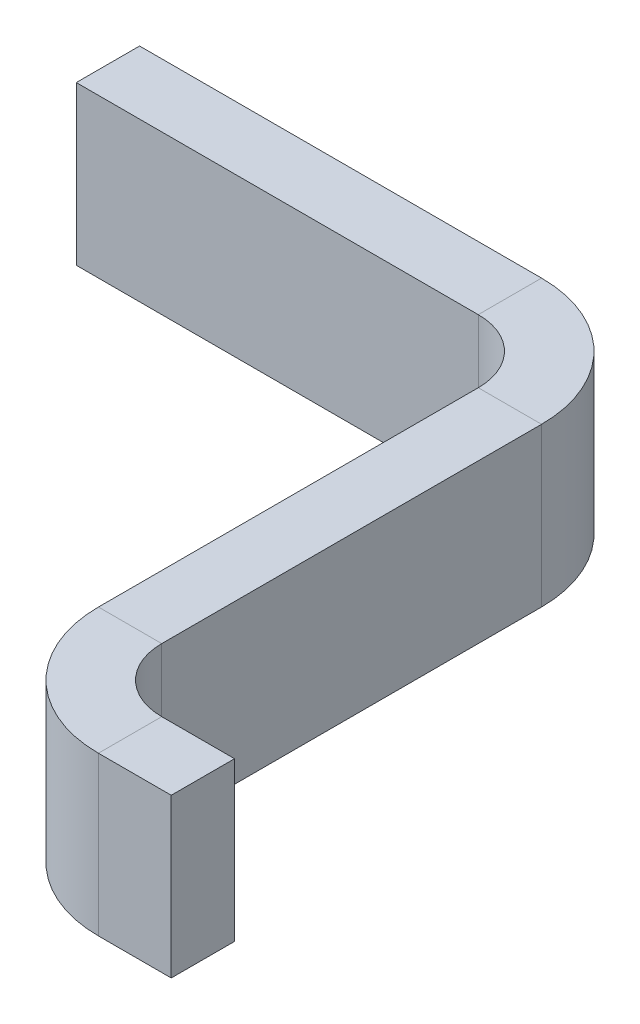
ISO-10303-21;
HEADER;
FILE_DESCRIPTION(('STEP AP214'),'2;1');
FILE_NAME('part.step','',(''),(''),'','','');
FILE_SCHEMA(('AUTOMOTIVE_DESIGN { 1 0 10303 214 1 1 1 1 }'));
ENDSEC;
DATA;
#1=APPLICATION_CONTEXT('core data for automotive mechanical design processes');
#2=APPLICATION_PROTOCOL_DEFINITION('international standard','automotive_design',2000,#1);
#3=PRODUCT_CONTEXT('',#1,'mechanical');
#4=PRODUCT('Part','Part','',(#3));
#5=PRODUCT_RELATED_PRODUCT_CATEGORY('part','',(#4));
#6=PRODUCT_DEFINITION_FORMATION('','',#4);
#7=PRODUCT_DEFINITION_CONTEXT('part definition',#1,'design');
#8=PRODUCT_DEFINITION('design','',#6,#7);
#9=PRODUCT_DEFINITION_SHAPE('','',#8);
#10=(LENGTH_UNIT() NAMED_UNIT(*) SI_UNIT(.MILLI.,.METRE.));
#11=(NAMED_UNIT(*) PLANE_ANGLE_UNIT() SI_UNIT($,.RADIAN.));
#12=(NAMED_UNIT(*) SI_UNIT($,.STERADIAN.) SOLID_ANGLE_UNIT());
#13=UNCERTAINTY_MEASURE_WITH_UNIT(LENGTH_MEASURE(1.E-05),#10,'distance_accuracy_value','');
#14=(GEOMETRIC_REPRESENTATION_CONTEXT(3) GLOBAL_UNCERTAINTY_ASSIGNED_CONTEXT((#13)) GLOBAL_UNIT_ASSIGNED_CONTEXT((#10,
#11,#12)) REPRESENTATION_CONTEXT('',''));
#15=CARTESIAN_POINT('',(0.,0.,0.));
#16=DIRECTION('',(0.,0.,1.));
#17=DIRECTION('',(1.,0.,0.));
#18=AXIS2_PLACEMENT_3D('',#15,#16,#17);
#19=CARTESIAN_POINT('',(41.393372284258,38.530963203594,0.));
#20=DIRECTION('',(1.,0.,0.));
#21=DIRECTION('',(0.,-1.,0.));
#22=AXIS2_PLACEMENT_3D('',#19,#20,#21);
#23=PLANE('',#22);
#24=DIRECTION('',(0.,1.,0.));
#25=VECTOR('',#24,1.);
#26=CARTESIAN_POINT('',(41.393372284258,38.530963203594,0.));
#27=LINE('',#26,#25);
#28=CARTESIAN_POINT('',(41.393372284258,38.280963203594,0.));
#29=VERTEX_POINT('',#28);
#30=CARTESIAN_POINT('',(41.393372284258,38.530963203594,0.));
#31=VERTEX_POINT('',#30);
#32=EDGE_CURVE('E261',#29,#31,#27,.T.);
#33=ORIENTED_EDGE('',*,*,#32,.F.);
#34=DIRECTION('',(0.,0.,-1.));
#35=VECTOR('',#34,1.);
#36=CARTESIAN_POINT('',(41.393372284258,38.280963203594,0.));
#37=LINE('',#36,#35);
#38=CARTESIAN_POINT('',(41.393372284258,38.280963203594,0.1));
#39=VERTEX_POINT('',#38);
#40=EDGE_CURVE('E11',#39,#29,#37,.T.);
#41=ORIENTED_EDGE('',*,*,#40,.F.);
#42=DIRECTION('',(0.,-1.,0.));
#43=VECTOR('',#42,1.);
#44=CARTESIAN_POINT('',(41.393372284258,38.280963203594,0.1));
#45=LINE('',#44,#43);
#46=CARTESIAN_POINT('',(41.393372284258,38.530963203594,0.1));
#47=VERTEX_POINT('',#46);
#48=EDGE_CURVE('E286',#47,#39,#45,.T.);
#49=ORIENTED_EDGE('',*,*,#48,.F.);
#50=DIRECTION('',(0.,0.,1.));
#51=VECTOR('',#50,1.);
#52=CARTESIAN_POINT('',(41.393372284258,38.530963203594,0.1));
#53=LINE('',#52,#51);
#54=EDGE_CURVE('E209',#31,#47,#53,.T.);
#55=ORIENTED_EDGE('',*,*,#54,.F.);
#56=EDGE_LOOP('',(#33,#41,#49,#55));
#57=FACE_BOUND('',#56,.T.);
#58=ADVANCED_FACE('F16',(#57),#23,.F.);
#59=CARTESIAN_POINT('',(42.028372284258,38.280963203594,0.));
#60=DIRECTION('',(0.,1.,0.));
#61=DIRECTION('',(1.,0.,0.));
#62=AXIS2_PLACEMENT_3D('',#59,#60,#61);
#63=PLANE('',#62);
#64=ORIENTED_EDGE('',*,*,#40,.T.);
#65=DIRECTION('',(-1.,0.,0.));
#66=VECTOR('',#65,1.);
#67=CARTESIAN_POINT('',(42.028372284258,38.280963203594,0.));
#68=LINE('',#67,#66);
#69=CARTESIAN_POINT('',(42.028372284258,38.280963203594,0.));
#70=VERTEX_POINT('',#69);
#71=EDGE_CURVE('E196',#70,#29,#68,.T.);
#72=ORIENTED_EDGE('',*,*,#71,.F.);
#73=DIRECTION('',(0.,0.,-1.));
#74=VECTOR('',#73,1.);
#75=CARTESIAN_POINT('',(42.028372284258,38.280963203594,0.));
#76=LINE('',#75,#74);
#77=CARTESIAN_POINT('',(42.028372284258,38.280963203594,0.1));
#78=VERTEX_POINT('',#77);
#79=EDGE_CURVE('E20',#78,#70,#76,.T.);
#80=ORIENTED_EDGE('',*,*,#79,.F.);
#81=DIRECTION('',(-1.,0.,0.));
#82=VECTOR('',#81,1.);
#83=CARTESIAN_POINT('',(42.028372284258,38.280963203594,0.1));
#84=LINE('',#83,#82);
#85=EDGE_CURVE('E287',#78,#39,#84,.T.);
#86=ORIENTED_EDGE('',*,*,#85,.T.);
#87=EDGE_LOOP('',(#64,#72,#80,#86));
#88=FACE_BOUND('',#87,.T.);
#89=ADVANCED_FACE('F18',(#88),#63,.F.);
#90=CARTESIAN_POINT('',(42.134438301436,38.280963203594,0.09393398282202));
#91=DIRECTION('',(0.,-1.,0.));
#92=DIRECTION('',(-1.,0.,0.));
#93=AXIS2_PLACEMENT_3D('',#90,#91,#92);
#94=PLANE('',#93);
#95=CARTESIAN_POINT('',(42.028372284258,38.280963203594,0.2));
#96=DIRECTION('',(0.,1.,0.));
#97=DIRECTION('',(0.,0.,-1.));
#98=AXIS2_PLACEMENT_3D('',#95,#96,#97);
#99=CIRCLE('',#98,0.1);
#100=CARTESIAN_POINT('',(42.128372284258,38.280963203594,0.2));
#101=VERTEX_POINT('',#100);
#102=EDGE_CURVE('E264',#101,#78,#99,.T.);
#103=ORIENTED_EDGE('',*,*,#102,.T.);
#104=ORIENTED_EDGE('',*,*,#79,.T.);
#105=CARTESIAN_POINT('',(42.028372284258,38.280963203594,0.2));
#106=DIRECTION('',(0.,1.,0.));
#107=DIRECTION('',(0.,0.,-1.));
#108=AXIS2_PLACEMENT_3D('',#105,#106,#107);
#109=CIRCLE('',#108,0.2);
#110=CARTESIAN_POINT('',(42.228372284258,38.280963203594,0.2));
#111=VERTEX_POINT('',#110);
#112=EDGE_CURVE('E164',#111,#70,#109,.T.);
#113=ORIENTED_EDGE('',*,*,#112,.F.);
#114=DIRECTION('',(1.,0.,0.));
#115=VECTOR('',#114,1.);
#116=CARTESIAN_POINT('',(42.228372284258,38.280963203594,0.2));
#117=LINE('',#116,#115);
#118=EDGE_CURVE('E153',#101,#111,#117,.T.);
#119=ORIENTED_EDGE('',*,*,#118,.F.);
#120=EDGE_LOOP('',(#103,#104,#113,#119));
#121=FACE_BOUND('',#120,.T.);
#122=ADVANCED_FACE('F378',(#121),#94,.T.);
#123=CARTESIAN_POINT('',(42.228372284258,38.280963203594,0.8));
#124=DIRECTION('',(0.,1.,0.));
#125=DIRECTION('',(1.,0.,0.));
#126=AXIS2_PLACEMENT_3D('',#123,#124,#125);
#127=PLANE('',#126);
#128=ORIENTED_EDGE('',*,*,#118,.T.);
#129=DIRECTION('',(0.,0.,-1.));
#130=VECTOR('',#129,1.);
#131=CARTESIAN_POINT('',(42.228372284258,38.280963203594,0.8));
#132=LINE('',#131,#130);
#133=CARTESIAN_POINT('',(42.228372284258,38.280963203594,0.8));
#134=VERTEX_POINT('',#133);
#135=EDGE_CURVE('E157',#134,#111,#132,.T.);
#136=ORIENTED_EDGE('',*,*,#135,.F.);
#137=DIRECTION('',(1.,0.,0.));
#138=VECTOR('',#137,1.);
#139=CARTESIAN_POINT('',(42.228372284258,38.280963203594,0.8));
#140=LINE('',#139,#138);
#141=CARTESIAN_POINT('',(42.128372284258,38.280963203594,0.8));
#142=VERTEX_POINT('',#141);
#143=EDGE_CURVE('E140',#142,#134,#140,.T.);
#144=ORIENTED_EDGE('',*,*,#143,.F.);
#145=DIRECTION('',(0.,0.,-1.));
#146=VECTOR('',#145,1.);
#147=CARTESIAN_POINT('',(42.128372284258,38.280963203594,0.8));
#148=LINE('',#147,#146);
#149=EDGE_CURVE('E265',#142,#101,#148,.T.);
#150=ORIENTED_EDGE('',*,*,#149,.T.);
#151=EDGE_LOOP('',(#128,#136,#144,#150));
#152=FACE_BOUND('',#151,.T.);
#153=ADVANCED_FACE('F158',(#152),#127,.F.);
#154=CARTESIAN_POINT('',(42.22230626708,38.280963203594,0.906066017178));
#155=DIRECTION('',(0.,-1.,0.));
#156=DIRECTION('',(-1.,0.,0.));
#157=AXIS2_PLACEMENT_3D('',#154,#155,#156);
#158=PLANE('',#157);
#159=CARTESIAN_POINT('',(42.328372284258,38.280963203594,0.8));
#160=DIRECTION('',(0.,-1.,0.));
#161=DIRECTION('',(0.,0.,-1.));
#162=AXIS2_PLACEMENT_3D('',#159,#160,#161);
#163=CIRCLE('',#162,0.2);
#164=CARTESIAN_POINT('',(42.328372284258,38.280963203594,1.));
#165=VERTEX_POINT('',#164);
#166=EDGE_CURVE('E147',#165,#142,#163,.T.);
#167=ORIENTED_EDGE('',*,*,#166,.T.);
#168=ORIENTED_EDGE('',*,*,#143,.T.);
#169=CARTESIAN_POINT('',(42.328372284258,38.280963203594,0.8));
#170=DIRECTION('',(0.,-1.,0.));
#171=DIRECTION('',(0.,0.,-1.));
#172=AXIS2_PLACEMENT_3D('',#169,#170,#171);
#173=CIRCLE('',#172,0.1);
#174=CARTESIAN_POINT('',(42.328372284258,38.280963203594,0.9));
#175=VERTEX_POINT('',#174);
#176=EDGE_CURVE('E144',#175,#134,#173,.T.);
#177=ORIENTED_EDGE('',*,*,#176,.F.);
#178=DIRECTION('',(0.,0.,-1.));
#179=VECTOR('',#178,1.);
#180=CARTESIAN_POINT('',(42.328372284258,38.280963203594,0.9));
#181=LINE('',#180,#179);
#182=EDGE_CURVE('E154',#165,#175,#181,.T.);
#183=ORIENTED_EDGE('',*,*,#182,.F.);
#184=EDGE_LOOP('',(#167,#168,#177,#183));
#185=FACE_BOUND('',#184,.T.);
#186=ADVANCED_FACE('F142',(#185),#158,.T.);
#187=CARTESIAN_POINT('',(42.443372284258,38.280963203594,0.9));
#188=DIRECTION('',(0.,1.,0.));
#189=DIRECTION('',(1.,0.,0.));
#190=AXIS2_PLACEMENT_3D('',#187,#188,#189);
#191=PLANE('',#190);
#192=ORIENTED_EDGE('',*,*,#182,.T.);
#193=DIRECTION('',(-1.,0.,0.));
#194=VECTOR('',#193,1.);
#195=CARTESIAN_POINT('',(42.443372284258,38.280963203594,0.9));
#196=LINE('',#195,#194);
#197=CARTESIAN_POINT('',(42.443372284258,38.280963203594,0.9));
#198=VERTEX_POINT('',#197);
#199=EDGE_CURVE('E184',#198,#175,#196,.T.);
#200=ORIENTED_EDGE('',*,*,#199,.F.);
#201=DIRECTION('',(0.,0.,-1.));
#202=VECTOR('',#201,1.);
#203=CARTESIAN_POINT('',(42.443372284258,38.280963203594,0.9));
#204=LINE('',#203,#202);
#205=CARTESIAN_POINT('',(42.443372284258,38.280963203594,1.));
#206=VERTEX_POINT('',#205);
#207=EDGE_CURVE('E241',#206,#198,#204,.T.);
#208=ORIENTED_EDGE('',*,*,#207,.F.);
#209=DIRECTION('',(-1.,0.,0.));
#210=VECTOR('',#209,1.);
#211=CARTESIAN_POINT('',(42.443372284258,38.280963203594,1.));
#212=LINE('',#211,#210);
#213=EDGE_CURVE('E245',#206,#165,#212,.T.);
#214=ORIENTED_EDGE('',*,*,#213,.T.);
#215=EDGE_LOOP('',(#192,#200,#208,#214));
#216=FACE_BOUND('',#215,.T.);
#217=ADVANCED_FACE('F358',(#216),#191,.F.);
#218=CARTESIAN_POINT('',(42.028372284258,38.280963203594,0.1));
#219=DIRECTION('',(0.,0.,-1.));
#220=DIRECTION('',(0.,-1.,0.));
#221=AXIS2_PLACEMENT_3D('',#218,#219,#220);
#222=PLANE('',#221);
#223=ORIENTED_EDGE('',*,*,#48,.T.);
#224=ORIENTED_EDGE('',*,*,#85,.F.);
#225=DIRECTION('',(0.,1.,0.));
#226=VECTOR('',#225,1.);
#227=CARTESIAN_POINT('',(42.028372284258,38.280963203594,0.1));
#228=LINE('',#227,#226);
#229=CARTESIAN_POINT('',(42.028372284258,38.530963203594,0.1));
#230=VERTEX_POINT('',#229);
#231=EDGE_CURVE('E262',#78,#230,#228,.T.);
#232=ORIENTED_EDGE('',*,*,#231,.T.);
#233=DIRECTION('',(-1.,0.,0.));
#234=VECTOR('',#233,1.);
#235=CARTESIAN_POINT('',(42.028372284258,38.530963203594,0.1));
#236=LINE('',#235,#234);
#237=EDGE_CURVE('E204',#230,#47,#236,.T.);
#238=ORIENTED_EDGE('',*,*,#237,.T.);
#239=EDGE_LOOP('',(#223,#224,#232,#238));
#240=FACE_BOUND('',#239,.T.);
#241=ADVANCED_FACE('F399',(#240),#222,.F.);
#242=CARTESIAN_POINT('',(42.028372284258,38.280963203594,0.2));
#243=DIRECTION('',(0.,1.,0.));
#244=DIRECTION('',(0.,0.,-1.));
#245=AXIS2_PLACEMENT_3D('',#242,#243,#244);
#246=CYLINDRICAL_SURFACE('',#245,0.1);
#247=ORIENTED_EDGE('',*,*,#231,.F.);
#248=ORIENTED_EDGE('',*,*,#102,.F.);
#249=DIRECTION('',(0.,-1.,0.));
#250=VECTOR('',#249,1.);
#251=CARTESIAN_POINT('',(42.128372284258,38.280963203594,0.2));
#252=LINE('',#251,#250);
#253=CARTESIAN_POINT('',(42.128372284258,38.530963203594,0.2));
#254=VERTEX_POINT('',#253);
#255=EDGE_CURVE('E230',#254,#101,#252,.T.);
#256=ORIENTED_EDGE('',*,*,#255,.F.);
#257=CARTESIAN_POINT('',(42.028372284258,38.530963203594,0.2));
#258=DIRECTION('',(0.,1.,0.));
#259=DIRECTION('',(0.,0.,-1.));
#260=AXIS2_PLACEMENT_3D('',#257,#258,#259);
#261=CIRCLE('',#260,0.1);
#262=EDGE_CURVE('E215',#254,#230,#261,.T.);
#263=ORIENTED_EDGE('',*,*,#262,.T.);
#264=EDGE_LOOP('',(#247,#248,#256,#263));
#265=FACE_BOUND('',#264,.T.);
#266=ADVANCED_FACE('F303',(#265),#246,.F.);
#267=CARTESIAN_POINT('',(42.128372284258,38.280963203594,0.8));
#268=DIRECTION('',(1.,0.,0.));
#269=DIRECTION('',(0.,-1.,0.));
#270=AXIS2_PLACEMENT_3D('',#267,#268,#269);
#271=PLANE('',#270);
#272=ORIENTED_EDGE('',*,*,#255,.T.);
#273=ORIENTED_EDGE('',*,*,#149,.F.);
#274=DIRECTION('',(0.,-1.,0.));
#275=VECTOR('',#274,1.);
#276=CARTESIAN_POINT('',(42.128372284258,38.280963203594,0.8));
#277=LINE('',#276,#275);
#278=CARTESIAN_POINT('',(42.128372284258,38.530963203594,0.8));
#279=VERTEX_POINT('',#278);
#280=EDGE_CURVE('E231',#279,#142,#277,.T.);
#281=ORIENTED_EDGE('',*,*,#280,.F.);
#282=DIRECTION('',(0.,0.,-1.));
#283=VECTOR('',#282,1.);
#284=CARTESIAN_POINT('',(42.128372284258,38.530963203594,0.8));
#285=LINE('',#284,#283);
#286=EDGE_CURVE('E220',#279,#254,#285,.T.);
#287=ORIENTED_EDGE('',*,*,#286,.T.);
#288=EDGE_LOOP('',(#272,#273,#281,#287));
#289=FACE_BOUND('',#288,.T.);
#290=ADVANCED_FACE('F296',(#289),#271,.F.);
#291=CARTESIAN_POINT('',(42.328372284258,38.280963203594,0.8));
#292=DIRECTION('',(0.,-1.,0.));
#293=DIRECTION('',(0.,0.,-1.));
#294=AXIS2_PLACEMENT_3D('',#291,#292,#293);
#295=CYLINDRICAL_SURFACE('',#294,0.2);
#296=CARTESIAN_POINT('',(42.328372284258,38.530963203594,0.8));
#297=DIRECTION('',(0.,-1.,0.));
#298=DIRECTION('',(0.,0.,-1.));
#299=AXIS2_PLACEMENT_3D('',#296,#297,#298);
#300=CIRCLE('',#299,0.2);
#301=CARTESIAN_POINT('',(42.328372284258,38.530963203594,1.));
#302=VERTEX_POINT('',#301);
#303=EDGE_CURVE('E221',#302,#279,#300,.T.);
#304=ORIENTED_EDGE('',*,*,#303,.T.);
#305=ORIENTED_EDGE('',*,*,#280,.T.);
#306=ORIENTED_EDGE('',*,*,#166,.F.);
#307=DIRECTION('',(0.,-1.,0.));
#308=VECTOR('',#307,1.);
#309=CARTESIAN_POINT('',(42.328372284258,38.280963203594,1.));
#310=LINE('',#309,#308);
#311=EDGE_CURVE('E208',#302,#165,#310,.T.);
#312=ORIENTED_EDGE('',*,*,#311,.F.);
#313=EDGE_LOOP('',(#304,#305,#306,#312));
#314=FACE_BOUND('',#313,.T.);
#315=ADVANCED_FACE('F322',(#314),#295,.T.);
#316=CARTESIAN_POINT('',(42.443372284258,38.280963203594,1.));
#317=DIRECTION('',(0.,0.,-1.));
#318=DIRECTION('',(0.,-1.,0.));
#319=AXIS2_PLACEMENT_3D('',#316,#317,#318);
#320=PLANE('',#319);
#321=ORIENTED_EDGE('',*,*,#311,.T.);
#322=ORIENTED_EDGE('',*,*,#213,.F.);
#323=DIRECTION('',(0.,-1.,0.));
#324=VECTOR('',#323,1.);
#325=CARTESIAN_POINT('',(42.443372284258,38.280963203594,1.));
#326=LINE('',#325,#324);
#327=CARTESIAN_POINT('',(42.443372284258,38.530963203594,1.));
#328=VERTEX_POINT('',#327);
#329=EDGE_CURVE('E236',#328,#206,#326,.T.);
#330=ORIENTED_EDGE('',*,*,#329,.F.);
#331=DIRECTION('',(-1.,0.,0.));
#332=VECTOR('',#331,1.);
#333=CARTESIAN_POINT('',(42.443372284258,38.530963203594,1.));
#334=LINE('',#333,#332);
#335=EDGE_CURVE('E198',#328,#302,#334,.T.);
#336=ORIENTED_EDGE('',*,*,#335,.T.);
#337=EDGE_LOOP('',(#321,#322,#330,#336));
#338=FACE_BOUND('',#337,.T.);
#339=ADVANCED_FACE('F361',(#338),#320,.F.);
#340=CARTESIAN_POINT('',(42.028372284258,38.530963203594,0.1));
#341=DIRECTION('',(0.,-1.,0.));
#342=DIRECTION('',(-1.,0.,0.));
#343=AXIS2_PLACEMENT_3D('',#340,#341,#342);
#344=PLANE('',#343);
#345=ORIENTED_EDGE('',*,*,#54,.T.);
#346=ORIENTED_EDGE('',*,*,#237,.F.);
#347=DIRECTION('',(0.,0.,1.));
#348=VECTOR('',#347,1.);
#349=CARTESIAN_POINT('',(42.028372284258,38.530963203594,0.1));
#350=LINE('',#349,#348);
#351=CARTESIAN_POINT('',(42.028372284258,38.530963203594,0.));
#352=VERTEX_POINT('',#351);
#353=EDGE_CURVE('E122',#352,#230,#350,.T.);
#354=ORIENTED_EDGE('',*,*,#353,.F.);
#355=DIRECTION('',(-1.,0.,0.));
#356=VECTOR('',#355,1.);
#357=CARTESIAN_POINT('',(42.028372284258,38.530963203594,0.));
#358=LINE('',#357,#356);
#359=EDGE_CURVE('E334',#352,#31,#358,.T.);
#360=ORIENTED_EDGE('',*,*,#359,.T.);
#361=EDGE_LOOP('',(#345,#346,#354,#360));
#362=FACE_BOUND('',#361,.T.);
#363=ADVANCED_FACE('F384',(#362),#344,.F.);
#364=CARTESIAN_POINT('',(42.134438301436,38.530963203594,0.09393398282202));
#365=DIRECTION('',(0.,1.,0.));
#366=DIRECTION('',(1.,0.,0.));
#367=AXIS2_PLACEMENT_3D('',#364,#365,#366);
#368=PLANE('',#367);
#369=CARTESIAN_POINT('',(42.028372284258,38.530963203594,0.2));
#370=DIRECTION('',(0.,1.,0.));
#371=DIRECTION('',(0.,0.,-1.));
#372=AXIS2_PLACEMENT_3D('',#369,#370,#371);
#373=CIRCLE('',#372,0.2);
#374=CARTESIAN_POINT('',(42.228372284258,38.530963203594,0.2));
#375=VERTEX_POINT('',#374);
#376=EDGE_CURVE('E257',#375,#352,#373,.T.);
#377=ORIENTED_EDGE('',*,*,#376,.T.);
#378=ORIENTED_EDGE('',*,*,#353,.T.);
#379=ORIENTED_EDGE('',*,*,#262,.F.);
#380=DIRECTION('',(-1.,0.,0.));
#381=VECTOR('',#380,1.);
#382=CARTESIAN_POINT('',(42.128372284258,38.530963203594,0.2));
#383=LINE('',#382,#381);
#384=EDGE_CURVE('E216',#375,#254,#383,.T.);
#385=ORIENTED_EDGE('',*,*,#384,.F.);
#386=EDGE_LOOP('',(#377,#378,#379,#385));
#387=FACE_BOUND('',#386,.T.);
#388=ADVANCED_FACE('F305',(#387),#368,.T.);
#389=CARTESIAN_POINT('',(42.128372284258,38.530963203594,0.8));
#390=DIRECTION('',(0.,-1.,0.));
#391=DIRECTION('',(-1.,0.,0.));
#392=AXIS2_PLACEMENT_3D('',#389,#390,#391);
#393=PLANE('',#392);
#394=ORIENTED_EDGE('',*,*,#384,.T.);
#395=ORIENTED_EDGE('',*,*,#286,.F.);
#396=DIRECTION('',(-1.,0.,0.));
#397=VECTOR('',#396,1.);
#398=CARTESIAN_POINT('',(42.128372284258,38.530963203594,0.8));
#399=LINE('',#398,#397);
#400=CARTESIAN_POINT('',(42.228372284258,38.530963203594,0.8));
#401=VERTEX_POINT('',#400);
#402=EDGE_CURVE('E202',#401,#279,#399,.T.);
#403=ORIENTED_EDGE('',*,*,#402,.F.);
#404=DIRECTION('',(0.,0.,-1.));
#405=VECTOR('',#404,1.);
#406=CARTESIAN_POINT('',(42.228372284258,38.530963203594,0.8));
#407=LINE('',#406,#405);
#408=EDGE_CURVE('E165',#401,#375,#407,.T.);
#409=ORIENTED_EDGE('',*,*,#408,.T.);
#410=EDGE_LOOP('',(#394,#395,#403,#409));
#411=FACE_BOUND('',#410,.T.);
#412=ADVANCED_FACE('F326',(#411),#393,.F.);
#413=CARTESIAN_POINT('',(42.22230626708,38.530963203594,0.906066017178));
#414=DIRECTION('',(0.,1.,0.));
#415=DIRECTION('',(1.,0.,0.));
#416=AXIS2_PLACEMENT_3D('',#413,#414,#415);
#417=PLANE('',#416);
#418=CARTESIAN_POINT('',(42.328372284258,38.530963203594,0.8));
#419=DIRECTION('',(0.,-1.,0.));
#420=DIRECTION('',(0.,0.,-1.));
#421=AXIS2_PLACEMENT_3D('',#418,#419,#420);
#422=CIRCLE('',#421,0.1);
#423=CARTESIAN_POINT('',(42.328372284258,38.530963203594,0.9));
#424=VERTEX_POINT('',#423);
#425=EDGE_CURVE('E177',#424,#401,#422,.T.);
#426=ORIENTED_EDGE('',*,*,#425,.T.);
#427=ORIENTED_EDGE('',*,*,#402,.T.);
#428=ORIENTED_EDGE('',*,*,#303,.F.);
#429=DIRECTION('',(0.,0.,1.));
#430=VECTOR('',#429,1.);
#431=CARTESIAN_POINT('',(42.328372284258,38.530963203594,1.));
#432=LINE('',#431,#430);
#433=EDGE_CURVE('E203',#424,#302,#432,.T.);
#434=ORIENTED_EDGE('',*,*,#433,.F.);
#435=EDGE_LOOP('',(#426,#427,#428,#434));
#436=FACE_BOUND('',#435,.T.);
#437=ADVANCED_FACE('F324',(#436),#417,.T.);
#438=CARTESIAN_POINT('',(42.443372284258,38.530963203594,1.));
#439=DIRECTION('',(0.,-1.,0.));
#440=DIRECTION('',(-1.,0.,0.));
#441=AXIS2_PLACEMENT_3D('',#438,#439,#440);
#442=PLANE('',#441);
#443=ORIENTED_EDGE('',*,*,#433,.T.);
#444=ORIENTED_EDGE('',*,*,#335,.F.);
#445=DIRECTION('',(0.,0.,1.));
#446=VECTOR('',#445,1.);
#447=CARTESIAN_POINT('',(42.443372284258,38.530963203594,1.));
#448=LINE('',#447,#446);
#449=CARTESIAN_POINT('',(42.443372284258,38.530963203594,0.9));
#450=VERTEX_POINT('',#449);
#451=EDGE_CURVE('E232',#450,#328,#448,.T.);
#452=ORIENTED_EDGE('',*,*,#451,.F.);
#453=DIRECTION('',(-1.,0.,0.));
#454=VECTOR('',#453,1.);
#455=CARTESIAN_POINT('',(42.443372284258,38.530963203594,0.9));
#456=LINE('',#455,#454);
#457=EDGE_CURVE('E192',#450,#424,#456,.T.);
#458=ORIENTED_EDGE('',*,*,#457,.T.);
#459=EDGE_LOOP('',(#443,#444,#452,#458));
#460=FACE_BOUND('',#459,.T.);
#461=ADVANCED_FACE('F362',(#460),#442,.F.);
#462=CARTESIAN_POINT('',(42.028372284258,38.530963203594,0.));
#463=DIRECTION('',(0.,0.,1.));
#464=DIRECTION('',(1.,0.,0.));
#465=AXIS2_PLACEMENT_3D('',#462,#463,#464);
#466=PLANE('',#465);
#467=ORIENTED_EDGE('',*,*,#32,.T.);
#468=ORIENTED_EDGE('',*,*,#359,.F.);
#469=DIRECTION('',(0.,1.,0.));
#470=VECTOR('',#469,1.);
#471=CARTESIAN_POINT('',(42.028372284258,38.530963203594,0.));
#472=LINE('',#471,#470);
#473=EDGE_CURVE('E225',#70,#352,#472,.T.);
#474=ORIENTED_EDGE('',*,*,#473,.F.);
#475=ORIENTED_EDGE('',*,*,#71,.T.);
#476=EDGE_LOOP('',(#467,#468,#474,#475));
#477=FACE_BOUND('',#476,.T.);
#478=ADVANCED_FACE('F333',(#477),#466,.F.);
#479=CARTESIAN_POINT('',(42.028372284258,38.530963203594,0.2));
#480=DIRECTION('',(0.,1.,0.));
#481=DIRECTION('',(0.,0.,-1.));
#482=AXIS2_PLACEMENT_3D('',#479,#480,#481);
#483=CYLINDRICAL_SURFACE('',#482,0.2);
#484=ORIENTED_EDGE('',*,*,#112,.T.);
#485=ORIENTED_EDGE('',*,*,#473,.T.);
#486=ORIENTED_EDGE('',*,*,#376,.F.);
#487=DIRECTION('',(0.,1.,0.));
#488=VECTOR('',#487,1.);
#489=CARTESIAN_POINT('',(42.228372284258,38.530963203594,0.2));
#490=LINE('',#489,#488);
#491=EDGE_CURVE('E176',#111,#375,#490,.T.);
#492=ORIENTED_EDGE('',*,*,#491,.F.);
#493=EDGE_LOOP('',(#484,#485,#486,#492));
#494=FACE_BOUND('',#493,.T.);
#495=ADVANCED_FACE('F328',(#494),#483,.T.);
#496=CARTESIAN_POINT('',(42.228372284258,38.530963203594,0.8));
#497=DIRECTION('',(-1.,0.,0.));
#498=DIRECTION('',(0.,0.,1.));
#499=AXIS2_PLACEMENT_3D('',#496,#497,#498);
#500=PLANE('',#499);
#501=ORIENTED_EDGE('',*,*,#491,.T.);
#502=ORIENTED_EDGE('',*,*,#408,.F.);
#503=DIRECTION('',(0.,-1.,0.));
#504=VECTOR('',#503,1.);
#505=CARTESIAN_POINT('',(42.228372284258,38.530963203594,0.8));
#506=LINE('',#505,#504);
#507=EDGE_CURVE('E172',#401,#134,#506,.T.);
#508=ORIENTED_EDGE('',*,*,#507,.T.);
#509=ORIENTED_EDGE('',*,*,#135,.T.);
#510=EDGE_LOOP('',(#501,#502,#508,#509));
#511=FACE_BOUND('',#510,.T.);
#512=ADVANCED_FACE('F180',(#511),#500,.F.);
#513=CARTESIAN_POINT('',(42.328372284258,38.530963203594,0.8));
#514=DIRECTION('',(0.,-1.,0.));
#515=DIRECTION('',(0.,0.,-1.));
#516=AXIS2_PLACEMENT_3D('',#513,#514,#515);
#517=CYLINDRICAL_SURFACE('',#516,0.1);
#518=ORIENTED_EDGE('',*,*,#507,.F.);
#519=ORIENTED_EDGE('',*,*,#425,.F.);
#520=DIRECTION('',(0.,1.,0.));
#521=VECTOR('',#520,1.);
#522=CARTESIAN_POINT('',(42.328372284258,38.530963203594,0.9));
#523=LINE('',#522,#521);
#524=EDGE_CURVE('E174',#175,#424,#523,.T.);
#525=ORIENTED_EDGE('',*,*,#524,.F.);
#526=ORIENTED_EDGE('',*,*,#176,.T.);
#527=EDGE_LOOP('',(#518,#519,#525,#526));
#528=FACE_BOUND('',#527,.T.);
#529=ADVANCED_FACE('F170',(#528),#517,.F.);
#530=CARTESIAN_POINT('',(42.443372284258,38.530963203594,0.9));
#531=DIRECTION('',(0.,0.,1.));
#532=DIRECTION('',(1.,0.,0.));
#533=AXIS2_PLACEMENT_3D('',#530,#531,#532);
#534=PLANE('',#533);
#535=ORIENTED_EDGE('',*,*,#524,.T.);
#536=ORIENTED_EDGE('',*,*,#457,.F.);
#537=DIRECTION('',(0.,1.,0.));
#538=VECTOR('',#537,1.);
#539=CARTESIAN_POINT('',(42.443372284258,38.530963203594,0.9));
#540=LINE('',#539,#538);
#541=EDGE_CURVE('E237',#198,#450,#540,.T.);
#542=ORIENTED_EDGE('',*,*,#541,.F.);
#543=ORIENTED_EDGE('',*,*,#199,.T.);
#544=EDGE_LOOP('',(#535,#536,#542,#543));
#545=FACE_BOUND('',#544,.T.);
#546=ADVANCED_FACE('F354',(#545),#534,.F.);
#547=CARTESIAN_POINT('',(42.443372284258,38.530963203594,0.9));
#548=DIRECTION('',(1.,0.,0.));
#549=DIRECTION('',(0.,-1.,0.));
#550=AXIS2_PLACEMENT_3D('',#547,#548,#549);
#551=PLANE('',#550);
#552=ORIENTED_EDGE('',*,*,#451,.T.);
#553=ORIENTED_EDGE('',*,*,#329,.T.);
#554=ORIENTED_EDGE('',*,*,#207,.T.);
#555=ORIENTED_EDGE('',*,*,#541,.T.);
#556=EDGE_LOOP('',(#552,#553,#554,#555));
#557=FACE_BOUND('',#556,.T.);
#558=ADVANCED_FACE('F390',(#557),#551,.T.);
#559=CLOSED_SHELL('',(#58,#89,#122,#153,#186,#217,#241,#266,#290,#315,#339,#363,#388,#412,#437,
#461,#478,#495,#512,#529,#546,#558));
#560=MANIFOLD_SOLID_BREP('B1',#559);
#561=ADVANCED_BREP_SHAPE_REPRESENTATION('',(#18,#560),#14);
#562=SHAPE_DEFINITION_REPRESENTATION(#9,#561);
ENDSEC;
END-ISO-10303-21;
